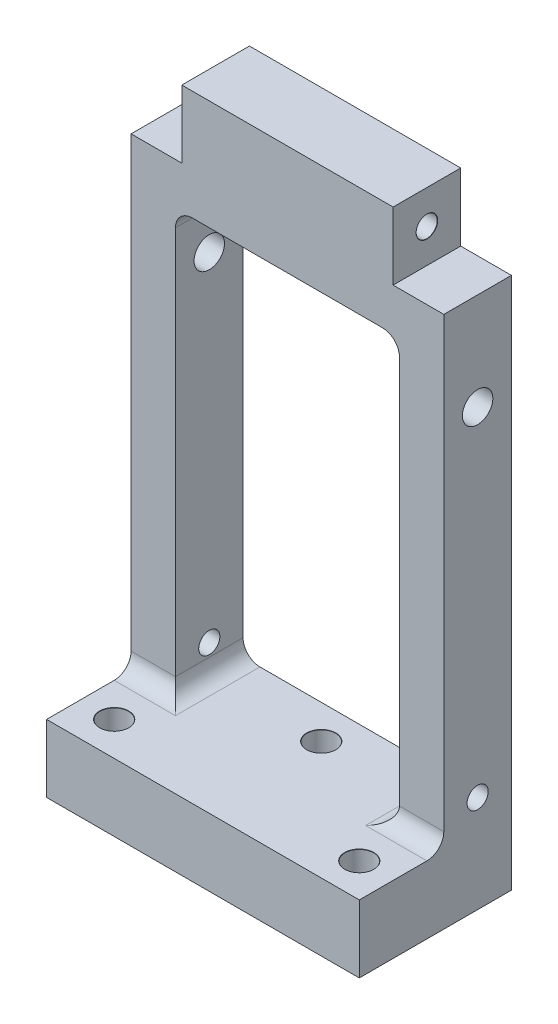
ISO-10303-21;
HEADER;
FILE_DESCRIPTION(('STEP AP214'),'2;1');
FILE_NAME('part.step','',(''),(''),'','','');
FILE_SCHEMA(('AUTOMOTIVE_DESIGN { 1 0 10303 214 1 1 1 1 }'));
ENDSEC;
DATA;
#1=APPLICATION_CONTEXT('core data for automotive mechanical design processes');
#2=APPLICATION_PROTOCOL_DEFINITION('international standard','automotive_design',2000,#1);
#3=PRODUCT_CONTEXT('',#1,'mechanical');
#4=PRODUCT('Part','Part','',(#3));
#5=PRODUCT_RELATED_PRODUCT_CATEGORY('part','',(#4));
#6=PRODUCT_DEFINITION_FORMATION('','',#4);
#7=PRODUCT_DEFINITION_CONTEXT('part definition',#1,'design');
#8=PRODUCT_DEFINITION('design','',#6,#7);
#9=PRODUCT_DEFINITION_SHAPE('','',#8);
#10=(LENGTH_UNIT() NAMED_UNIT(*) SI_UNIT(.MILLI.,.METRE.));
#11=(NAMED_UNIT(*) PLANE_ANGLE_UNIT() SI_UNIT($,.RADIAN.));
#12=(NAMED_UNIT(*) SI_UNIT($,.STERADIAN.) SOLID_ANGLE_UNIT());
#13=UNCERTAINTY_MEASURE_WITH_UNIT(LENGTH_MEASURE(1.E-05),#10,'distance_accuracy_value','');
#14=(GEOMETRIC_REPRESENTATION_CONTEXT(3) GLOBAL_UNCERTAINTY_ASSIGNED_CONTEXT((#13)) GLOBAL_UNIT_ASSIGNED_CONTEXT((#10,
#11,#12)) REPRESENTATION_CONTEXT('',''));
#15=CARTESIAN_POINT('',(0.,0.,0.));
#16=DIRECTION('',(0.,0.,1.));
#17=DIRECTION('',(1.,0.,0.));
#18=AXIS2_PLACEMENT_3D('',#15,#16,#17);
#19=CARTESIAN_POINT('',(-18.5,63.,8.));
#20=DIRECTION('',(0.,-1.,0.));
#21=DIRECTION('',(0.,0.,-1.));
#22=AXIS2_PLACEMENT_3D('',#19,#20,#21);
#23=PLANE('',#22);
#24=DIRECTION('',(0.,0.,-1.));
#25=VECTOR('',#24,1.);
#26=CARTESIAN_POINT('',(12.5,63.,34.2488094968134));
#27=LINE('',#26,#25);
#28=CARTESIAN_POINT('',(12.5,63.,8.));
#29=VERTEX_POINT('',#28);
#30=CARTESIAN_POINT('',(12.5,63.,0.));
#31=VERTEX_POINT('',#30);
#32=EDGE_CURVE('E65',#29,#31,#27,.T.);
#33=ORIENTED_EDGE('',*,*,#32,.F.);
#34=DIRECTION('',(-1.,0.,0.));
#35=VECTOR('',#34,1.);
#36=CARTESIAN_POINT('',(-18.5,63.,8.));
#37=LINE('',#36,#35);
#38=CARTESIAN_POINT('',(18.5,63.,8.));
#39=VERTEX_POINT('',#38);
#40=EDGE_CURVE('E332',#39,#29,#37,.T.);
#41=ORIENTED_EDGE('',*,*,#40,.F.);
#42=DIRECTION('',(0.,0.,-1.));
#43=VECTOR('',#42,1.);
#44=CARTESIAN_POINT('',(18.5,63.,8.));
#45=LINE('',#44,#43);
#46=CARTESIAN_POINT('',(18.5,63.,0.));
#47=VERTEX_POINT('',#46);
#48=EDGE_CURVE('E350',#39,#47,#45,.T.);
#49=ORIENTED_EDGE('',*,*,#48,.T.);
#50=DIRECTION('',(-1.,0.,0.));
#51=VECTOR('',#50,1.);
#52=CARTESIAN_POINT('',(-18.5,63.,0.));
#53=LINE('',#52,#51);
#54=EDGE_CURVE('E329',#47,#31,#53,.T.);
#55=ORIENTED_EDGE('',*,*,#54,.T.);
#56=EDGE_LOOP('',(#33,#41,#49,#55));
#57=FACE_BOUND('',#56,.T.);
#58=ADVANCED_FACE('F39',(#57),#23,.F.);
#59=CARTESIAN_POINT('',(0.,0.,8.));
#60=DIRECTION('',(0.,0.,-1.));
#61=DIRECTION('',(-1.,0.,0.));
#62=AXIS2_PLACEMENT_3D('',#59,#60,#61);
#63=PLANE('',#62);
#64=DIRECTION('',(0.,1.,0.));
#65=VECTOR('',#64,1.);
#66=CARTESIAN_POINT('',(13.25,58.,8.));
#67=LINE('',#66,#65);
#68=CARTESIAN_POINT('',(13.25,10.,8.));
#69=VERTEX_POINT('',#68);
#70=CARTESIAN_POINT('',(13.25,56.,8.));
#71=VERTEX_POINT('',#70);
#72=EDGE_CURVE('E289',#69,#71,#67,.T.);
#73=ORIENTED_EDGE('',*,*,#72,.F.);
#74=DIRECTION('',(-1.,0.,0.));
#75=VECTOR('',#74,1.);
#76=CARTESIAN_POINT('',(0.,10.,8.));
#77=LINE('',#76,#75);
#78=CARTESIAN_POINT('',(18.5,10.,8.));
#79=VERTEX_POINT('',#78);
#80=EDGE_CURVE('E399',#69,#79,#77,.F.);
#81=ORIENTED_EDGE('',*,*,#80,.T.);
#82=DIRECTION('',(0.,1.,0.));
#83=VECTOR('',#82,1.);
#84=CARTESIAN_POINT('',(18.5,0.,8.));
#85=LINE('',#84,#83);
#86=EDGE_CURVE('E328',#79,#39,#85,.T.);
#87=ORIENTED_EDGE('',*,*,#86,.T.);
#88=ORIENTED_EDGE('',*,*,#40,.T.);
#89=DIRECTION('',(0.,1.,0.));
#90=VECTOR('',#89,1.);
#91=CARTESIAN_POINT('',(12.5,63.,8.));
#92=LINE('',#91,#90);
#93=CARTESIAN_POINT('',(12.5,71.,8.));
#94=VERTEX_POINT('',#93);
#95=EDGE_CURVE('E215',#29,#94,#92,.T.);
#96=ORIENTED_EDGE('',*,*,#95,.T.);
#97=DIRECTION('',(-1.,0.,0.));
#98=VECTOR('',#97,1.);
#99=CARTESIAN_POINT('',(-12.5,71.,8.));
#100=LINE('',#99,#98);
#101=CARTESIAN_POINT('',(-12.5,71.,8.));
#102=VERTEX_POINT('',#101);
#103=EDGE_CURVE('E220',#94,#102,#100,.T.);
#104=ORIENTED_EDGE('',*,*,#103,.T.);
#105=DIRECTION('',(0.,-1.,0.));
#106=VECTOR('',#105,1.);
#107=CARTESIAN_POINT('',(-12.5,63.,8.));
#108=LINE('',#107,#106);
#109=CARTESIAN_POINT('',(-12.5,63.,8.));
#110=VERTEX_POINT('',#109);
#111=EDGE_CURVE('E180',#102,#110,#108,.T.);
#112=ORIENTED_EDGE('',*,*,#111,.T.);
#113=CARTESIAN_POINT('',(-18.5,63.,8.));
#114=VERTEX_POINT('',#113);
#115=EDGE_CURVE('E57',#110,#114,#37,.T.);
#116=ORIENTED_EDGE('',*,*,#115,.T.);
#117=DIRECTION('',(0.,-1.,0.));
#118=VECTOR('',#117,1.);
#119=CARTESIAN_POINT('',(-18.5,0.,8.));
#120=LINE('',#119,#118);
#121=CARTESIAN_POINT('',(-18.5,9.99999999999999,8.));
#122=VERTEX_POINT('',#121);
#123=EDGE_CURVE('E324',#114,#122,#120,.T.);
#124=ORIENTED_EDGE('',*,*,#123,.T.);
#125=DIRECTION('',(-1.,0.,0.));
#126=VECTOR('',#125,1.);
#127=CARTESIAN_POINT('',(0.,10.,8.));
#128=LINE('',#127,#126);
#129=CARTESIAN_POINT('',(-13.25,9.99999999999999,8.));
#130=VERTEX_POINT('',#129);
#131=EDGE_CURVE('E396',#122,#130,#128,.F.);
#132=ORIENTED_EDGE('',*,*,#131,.T.);
#133=DIRECTION('',(0.,-1.,0.));
#134=VECTOR('',#133,1.);
#135=CARTESIAN_POINT('',(-13.25,58.,8.));
#136=LINE('',#135,#134);
#137=CARTESIAN_POINT('',(-13.25,56.,8.));
#138=VERTEX_POINT('',#137);
#139=EDGE_CURVE('E285',#138,#130,#136,.T.);
#140=ORIENTED_EDGE('',*,*,#139,.F.);
#141=CARTESIAN_POINT('',(-11.25,56.,8.));
#142=DIRECTION('',(0.,0.,-1.));
#143=DIRECTION('',(-1.,0.,0.));
#144=AXIS2_PLACEMENT_3D('',#141,#142,#143);
#145=CIRCLE('',#144,2.);
#146=CARTESIAN_POINT('',(-11.25,58.,8.));
#147=VERTEX_POINT('',#146);
#148=EDGE_CURVE('E402',#138,#147,#145,.T.);
#149=ORIENTED_EDGE('',*,*,#148,.T.);
#150=DIRECTION('',(-1.,0.,0.));
#151=VECTOR('',#150,1.);
#152=CARTESIAN_POINT('',(-13.25,58.,8.));
#153=LINE('',#152,#151);
#154=CARTESIAN_POINT('',(11.25,58.,8.));
#155=VERTEX_POINT('',#154);
#156=EDGE_CURVE('E293',#155,#147,#153,.T.);
#157=ORIENTED_EDGE('',*,*,#156,.F.);
#158=CARTESIAN_POINT('',(11.25,56.,8.));
#159=DIRECTION('',(0.,0.,-1.));
#160=DIRECTION('',(-1.,0.,0.));
#161=AXIS2_PLACEMENT_3D('',#158,#159,#160);
#162=CIRCLE('',#161,2.);
#163=EDGE_CURVE('E408',#155,#71,#162,.T.);
#164=ORIENTED_EDGE('',*,*,#163,.T.);
#165=EDGE_LOOP('',(#73,#81,#87,#88,#96,#104,#112,#116,#124,#132,#140,#149,#157,#164));
#166=FACE_BOUND('',#165,.T.);
#167=ADVANCED_FACE('F447',(#166),#63,.F.);
#168=CARTESIAN_POINT('',(-18.5,0.,8.));
#169=DIRECTION('',(1.,0.,0.));
#170=DIRECTION('',(0.,1.,0.));
#171=AXIS2_PLACEMENT_3D('',#168,#169,#170);
#172=PLANE('',#171);
#173=CARTESIAN_POINT('',(-18.5,51.5,4.00000000000001));
#174=DIRECTION('',(-1.,0.,0.));
#175=DIRECTION('',(0.,0.,1.));
#176=AXIS2_PLACEMENT_3D('',#173,#174,#175);
#177=CIRCLE('',#176,1.825);
#178=CARTESIAN_POINT('',(-18.5,51.5,5.82500000000001));
#179=VERTEX_POINT('',#178);
#180=EDGE_CURVE('E902',#179,#179,#177,.T.);
#181=ORIENTED_EDGE('',*,*,#180,.F.);
#182=EDGE_LOOP('',(#181));
#183=FACE_BOUND('',#182,.T.);
#184=CARTESIAN_POINT('',(-18.5,11.5,4.00000000000001));
#185=DIRECTION('',(-1.,0.,0.));
#186=DIRECTION('',(0.,0.,1.));
#187=AXIS2_PLACEMENT_3D('',#184,#185,#186);
#188=CIRCLE('',#187,1.275);
#189=CARTESIAN_POINT('',(-18.5,11.5,5.27500000000001));
#190=VERTEX_POINT('',#189);
#191=EDGE_CURVE('E439',#190,#190,#188,.T.);
#192=ORIENTED_EDGE('',*,*,#191,.F.);
#193=EDGE_LOOP('',(#192));
#194=FACE_BOUND('',#193,.T.);
#195=DIRECTION('',(0.,-1.,0.));
#196=VECTOR('',#195,1.);
#197=CARTESIAN_POINT('',(-18.5,0.,0.));
#198=LINE('',#197,#196);
#199=CARTESIAN_POINT('',(-18.5,63.,0.));
#200=VERTEX_POINT('',#199);
#201=CARTESIAN_POINT('',(-18.5,0.,0.));
#202=VERTEX_POINT('',#201);
#203=EDGE_CURVE('E310',#200,#202,#198,.T.);
#204=ORIENTED_EDGE('',*,*,#203,.T.);
#205=DIRECTION('',(0.,0.,-1.));
#206=VECTOR('',#205,1.);
#207=CARTESIAN_POINT('',(-18.5,0.,8.));
#208=LINE('',#207,#206);
#209=CARTESIAN_POINT('',(-18.5,0.,18.));
#210=VERTEX_POINT('',#209);
#211=EDGE_CURVE('E358',#210,#202,#208,.T.);
#212=ORIENTED_EDGE('',*,*,#211,.F.);
#213=DIRECTION('',(0.,1.,0.));
#214=VECTOR('',#213,1.);
#215=CARTESIAN_POINT('',(-18.5,0.,18.));
#216=LINE('',#215,#214);
#217=CARTESIAN_POINT('',(-18.5,7.99999999999999,18.));
#218=VERTEX_POINT('',#217);
#219=EDGE_CURVE('E301',#210,#218,#216,.T.);
#220=ORIENTED_EDGE('',*,*,#219,.T.);
#221=DIRECTION('',(0.,0.,-1.));
#222=VECTOR('',#221,1.);
#223=CARTESIAN_POINT('',(-18.5,7.99999999999999,8.));
#224=LINE('',#223,#222);
#225=CARTESIAN_POINT('',(-18.5,7.99999999999999,10.));
#226=VERTEX_POINT('',#225);
#227=EDGE_CURVE('E314',#218,#226,#224,.T.);
#228=ORIENTED_EDGE('',*,*,#227,.T.);
#229=CARTESIAN_POINT('',(-18.5,9.99999999999999,10.));
#230=DIRECTION('',(1.,0.,0.));
#231=DIRECTION('',(0.,1.,0.));
#232=AXIS2_PLACEMENT_3D('',#229,#230,#231);
#233=CIRCLE('',#232,2.);
#234=EDGE_CURVE('E49',#226,#122,#233,.T.);
#235=ORIENTED_EDGE('',*,*,#234,.T.);
#236=ORIENTED_EDGE('',*,*,#123,.F.);
#237=DIRECTION('',(0.,0.,-1.));
#238=VECTOR('',#237,1.);
#239=CARTESIAN_POINT('',(-18.5,63.,8.));
#240=LINE('',#239,#238);
#241=EDGE_CURVE('E335',#114,#200,#240,.T.);
#242=ORIENTED_EDGE('',*,*,#241,.T.);
#243=EDGE_LOOP('',(#204,#212,#220,#228,#235,#236,#242));
#244=FACE_BOUND('',#243,.T.);
#245=ADVANCED_FACE('F452',(#183,#194,#244),#172,.F.);
#246=CARTESIAN_POINT('',(-18.5,0.,8.));
#247=DIRECTION('',(0.,1.,0.));
#248=DIRECTION('',(-1.,0.,0.));
#249=AXIS2_PLACEMENT_3D('',#246,#247,#248);
#250=PLANE('',#249);
#251=CARTESIAN_POINT('',(-14.5,0.,14.));
#252=DIRECTION('',(0.,1.,0.));
#253=DIRECTION('',(0.,0.,1.));
#254=AXIS2_PLACEMENT_3D('',#251,#252,#253);
#255=CIRCLE('',#254,1.725);
#256=CARTESIAN_POINT('',(-14.5,0.,15.725));
#257=VERTEX_POINT('',#256);
#258=EDGE_CURVE('E224',#257,#257,#255,.T.);
#259=ORIENTED_EDGE('',*,*,#258,.T.);
#260=EDGE_LOOP('',(#259));
#261=FACE_BOUND('',#260,.T.);
#262=CARTESIAN_POINT('',(14.5,0.,14.));
#263=DIRECTION('',(0.,1.,0.));
#264=DIRECTION('',(0.,0.,1.));
#265=AXIS2_PLACEMENT_3D('',#262,#263,#264);
#266=CIRCLE('',#265,1.725);
#267=CARTESIAN_POINT('',(14.5,0.,15.725));
#268=VERTEX_POINT('',#267);
#269=EDGE_CURVE('E241',#268,#268,#266,.T.);
#270=ORIENTED_EDGE('',*,*,#269,.T.);
#271=EDGE_LOOP('',(#270));
#272=FACE_BOUND('',#271,.T.);
#273=CARTESIAN_POINT('',(0.,0.,4.));
#274=DIRECTION('',(0.,1.,0.));
#275=DIRECTION('',(0.,0.,1.));
#276=AXIS2_PLACEMENT_3D('',#273,#274,#275);
#277=CIRCLE('',#276,1.725);
#278=CARTESIAN_POINT('',(0.,0.,5.725));
#279=VERTEX_POINT('',#278);
#280=EDGE_CURVE('E257',#279,#279,#277,.T.);
#281=ORIENTED_EDGE('',*,*,#280,.T.);
#282=EDGE_LOOP('',(#281));
#283=FACE_BOUND('',#282,.T.);
#284=DIRECTION('',(1.,0.,0.));
#285=VECTOR('',#284,1.);
#286=CARTESIAN_POINT('',(-18.5,0.,0.));
#287=LINE('',#286,#285);
#288=CARTESIAN_POINT('',(18.5,0.,0.));
#289=VERTEX_POINT('',#288);
#290=EDGE_CURVE('E339',#202,#289,#287,.T.);
#291=ORIENTED_EDGE('',*,*,#290,.T.);
#292=DIRECTION('',(0.,0.,-1.));
#293=VECTOR('',#292,1.);
#294=CARTESIAN_POINT('',(18.5,0.,8.));
#295=LINE('',#294,#293);
#296=CARTESIAN_POINT('',(18.5,0.,18.));
#297=VERTEX_POINT('',#296);
#298=EDGE_CURVE('E354',#297,#289,#295,.T.);
#299=ORIENTED_EDGE('',*,*,#298,.F.);
#300=DIRECTION('',(-1.,0.,0.));
#301=VECTOR('',#300,1.);
#302=CARTESIAN_POINT('',(31.3062484748657,0.,18.));
#303=LINE('',#302,#301);
#304=EDGE_CURVE('E318',#297,#210,#303,.T.);
#305=ORIENTED_EDGE('',*,*,#304,.T.);
#306=ORIENTED_EDGE('',*,*,#211,.T.);
#307=EDGE_LOOP('',(#291,#299,#305,#306));
#308=FACE_BOUND('',#307,.T.);
#309=ADVANCED_FACE('F456',(#261,#272,#283,#308),#250,.F.);
#310=CARTESIAN_POINT('',(18.5,0.,8.));
#311=DIRECTION('',(-1.,0.,0.));
#312=DIRECTION('',(0.,-1.,0.));
#313=AXIS2_PLACEMENT_3D('',#310,#311,#312);
#314=PLANE('',#313);
#315=CARTESIAN_POINT('',(18.5,51.5,4.00000000000001));
#316=DIRECTION('',(-1.,0.,0.));
#317=DIRECTION('',(0.,0.,1.));
#318=AXIS2_PLACEMENT_3D('',#315,#316,#317);
#319=CIRCLE('',#318,1.79999999999999);
#320=CARTESIAN_POINT('',(18.5,51.5,5.8));
#321=VERTEX_POINT('',#320);
#322=EDGE_CURVE('E910',#321,#321,#319,.T.);
#323=ORIENTED_EDGE('',*,*,#322,.T.);
#324=EDGE_LOOP('',(#323));
#325=FACE_BOUND('',#324,.T.);
#326=CARTESIAN_POINT('',(18.5,11.5,4.00000000000001));
#327=DIRECTION('',(-1.,0.,0.));
#328=DIRECTION('',(0.,0.,1.));
#329=AXIS2_PLACEMENT_3D('',#326,#327,#328);
#330=CIRCLE('',#329,1.24999999999999);
#331=CARTESIAN_POINT('',(18.5,11.5,5.25));
#332=VERTEX_POINT('',#331);
#333=EDGE_CURVE('E428',#332,#332,#330,.T.);
#334=ORIENTED_EDGE('',*,*,#333,.T.);
#335=EDGE_LOOP('',(#334));
#336=FACE_BOUND('',#335,.T.);
#337=DIRECTION('',(0.,1.,0.));
#338=VECTOR('',#337,1.);
#339=CARTESIAN_POINT('',(18.5,0.,0.));
#340=LINE('',#339,#338);
#341=EDGE_CURVE('E342',#289,#47,#340,.T.);
#342=ORIENTED_EDGE('',*,*,#341,.T.);
#343=ORIENTED_EDGE('',*,*,#48,.F.);
#344=ORIENTED_EDGE('',*,*,#86,.F.);
#345=CARTESIAN_POINT('',(18.5,10.,10.));
#346=DIRECTION('',(-1.,0.,0.));
#347=DIRECTION('',(0.,-1.,0.));
#348=AXIS2_PLACEMENT_3D('',#345,#346,#347);
#349=CIRCLE('',#348,2.);
#350=CARTESIAN_POINT('',(18.5,8.00000000000001,10.));
#351=VERTEX_POINT('',#350);
#352=EDGE_CURVE('E414',#79,#351,#349,.T.);
#353=ORIENTED_EDGE('',*,*,#352,.T.);
#354=DIRECTION('',(0.,0.,1.));
#355=VECTOR('',#354,1.);
#356=CARTESIAN_POINT('',(18.5,8.00000000000001,8.));
#357=LINE('',#356,#355);
#358=CARTESIAN_POINT('',(18.5,8.00000000000001,18.));
#359=VERTEX_POINT('',#358);
#360=EDGE_CURVE('E306',#351,#359,#357,.T.);
#361=ORIENTED_EDGE('',*,*,#360,.T.);
#362=DIRECTION('',(0.,-1.,0.));
#363=VECTOR('',#362,1.);
#364=CARTESIAN_POINT('',(18.5,0.,18.));
#365=LINE('',#364,#363);
#366=EDGE_CURVE('E302',#359,#297,#365,.T.);
#367=ORIENTED_EDGE('',*,*,#366,.T.);
#368=ORIENTED_EDGE('',*,*,#298,.T.);
#369=EDGE_LOOP('',(#342,#343,#344,#353,#361,#367,#368));
#370=FACE_BOUND('',#369,.T.);
#371=ADVANCED_FACE('F510',(#325,#336,#370),#314,.F.);
#372=ORIENTED_EDGE('',*,*,#115,.F.);
#373=DIRECTION('',(0.,0.,-1.));
#374=VECTOR('',#373,1.);
#375=CARTESIAN_POINT('',(-12.5,63.,34.2488094968134));
#376=LINE('',#375,#374);
#377=CARTESIAN_POINT('',(-12.5,63.,0.));
#378=VERTEX_POINT('',#377);
#379=EDGE_CURVE('E212',#110,#378,#376,.T.);
#380=ORIENTED_EDGE('',*,*,#379,.T.);
#381=EDGE_CURVE('E199',#378,#200,#53,.T.);
#382=ORIENTED_EDGE('',*,*,#381,.T.);
#383=ORIENTED_EDGE('',*,*,#241,.F.);
#384=EDGE_LOOP('',(#372,#380,#382,#383));
#385=FACE_BOUND('',#384,.T.);
#386=ADVANCED_FACE('F448',(#385),#23,.F.);
#387=CARTESIAN_POINT('',(0.,0.,0.));
#388=DIRECTION('',(0.,0.,-1.));
#389=DIRECTION('',(-1.,0.,0.));
#390=AXIS2_PLACEMENT_3D('',#387,#388,#389);
#391=PLANE('',#390);
#392=DIRECTION('',(-1.,0.,0.));
#393=VECTOR('',#392,1.);
#394=CARTESIAN_POINT('',(-13.25,58.,0.));
#395=LINE('',#394,#393);
#396=CARTESIAN_POINT('',(11.25,58.,0.));
#397=VERTEX_POINT('',#396);
#398=CARTESIAN_POINT('',(-11.25,58.,0.));
#399=VERTEX_POINT('',#398);
#400=EDGE_CURVE('E277',#397,#399,#395,.T.);
#401=ORIENTED_EDGE('',*,*,#400,.T.);
#402=CARTESIAN_POINT('',(-11.25,56.,0.));
#403=DIRECTION('',(0.,0.,-1.));
#404=DIRECTION('',(-1.,0.,0.));
#405=AXIS2_PLACEMENT_3D('',#402,#403,#404);
#406=CIRCLE('',#405,2.);
#407=CARTESIAN_POINT('',(-13.25,56.,0.));
#408=VERTEX_POINT('',#407);
#409=EDGE_CURVE('E405',#399,#408,#406,.F.);
#410=ORIENTED_EDGE('',*,*,#409,.T.);
#411=DIRECTION('',(0.,-1.,0.));
#412=VECTOR('',#411,1.);
#413=CARTESIAN_POINT('',(-13.25,58.,0.));
#414=LINE('',#413,#412);
#415=CARTESIAN_POINT('',(-13.25,9.99999999999999,0.));
#416=VERTEX_POINT('',#415);
#417=EDGE_CURVE('E281',#408,#416,#414,.T.);
#418=ORIENTED_EDGE('',*,*,#417,.T.);
#419=CARTESIAN_POINT('',(-11.25,10.,0.));
#420=DIRECTION('',(0.,0.,-1.));
#421=DIRECTION('',(-1.,0.,0.));
#422=AXIS2_PLACEMENT_3D('',#419,#420,#421);
#423=CIRCLE('',#422,2.);
#424=CARTESIAN_POINT('',(-11.25,8.00000000000001,0.));
#425=VERTEX_POINT('',#424);
#426=EDGE_CURVE('E11',#416,#425,#423,.F.);
#427=ORIENTED_EDGE('',*,*,#426,.T.);
#428=DIRECTION('',(1.,0.,0.));
#429=VECTOR('',#428,1.);
#430=CARTESIAN_POINT('',(-13.25,8.00000000000001,0.));
#431=LINE('',#430,#429);
#432=CARTESIAN_POINT('',(11.25,8.00000000000001,0.));
#433=VERTEX_POINT('',#432);
#434=EDGE_CURVE('E297',#425,#433,#431,.T.);
#435=ORIENTED_EDGE('',*,*,#434,.T.);
#436=CARTESIAN_POINT('',(11.25,10.,0.));
#437=DIRECTION('',(0.,0.,-1.));
#438=DIRECTION('',(-1.,0.,0.));
#439=AXIS2_PLACEMENT_3D('',#436,#437,#438);
#440=CIRCLE('',#439,2.);
#441=CARTESIAN_POINT('',(13.25,10.,0.));
#442=VERTEX_POINT('',#441);
#443=EDGE_CURVE('E417',#433,#442,#440,.F.);
#444=ORIENTED_EDGE('',*,*,#443,.T.);
#445=DIRECTION('',(0.,1.,0.));
#446=VECTOR('',#445,1.);
#447=CARTESIAN_POINT('',(13.25,58.,0.));
#448=LINE('',#447,#446);
#449=CARTESIAN_POINT('',(13.25,56.,0.));
#450=VERTEX_POINT('',#449);
#451=EDGE_CURVE('E273',#442,#450,#448,.T.);
#452=ORIENTED_EDGE('',*,*,#451,.T.);
#453=CARTESIAN_POINT('',(11.25,56.,0.));
#454=DIRECTION('',(0.,0.,-1.));
#455=DIRECTION('',(-1.,0.,0.));
#456=AXIS2_PLACEMENT_3D('',#453,#454,#455);
#457=CIRCLE('',#456,2.);
#458=EDGE_CURVE('E411',#450,#397,#457,.F.);
#459=ORIENTED_EDGE('',*,*,#458,.T.);
#460=EDGE_LOOP('',(#401,#410,#418,#427,#435,#444,#452,#459));
#461=FACE_BOUND('',#460,.T.);
#462=ORIENTED_EDGE('',*,*,#203,.F.);
#463=ORIENTED_EDGE('',*,*,#381,.F.);
#464=DIRECTION('',(0.,1.,0.));
#465=VECTOR('',#464,1.);
#466=CARTESIAN_POINT('',(-12.5,63.,0.));
#467=LINE('',#466,#465);
#468=CARTESIAN_POINT('',(-12.5,71.,0.));
#469=VERTEX_POINT('',#468);
#470=EDGE_CURVE('E179',#378,#469,#467,.T.);
#471=ORIENTED_EDGE('',*,*,#470,.T.);
#472=DIRECTION('',(1.,0.,0.));
#473=VECTOR('',#472,1.);
#474=CARTESIAN_POINT('',(-12.5,71.,0.));
#475=LINE('',#474,#473);
#476=CARTESIAN_POINT('',(12.5,71.,0.));
#477=VERTEX_POINT('',#476);
#478=EDGE_CURVE('E188',#469,#477,#475,.T.);
#479=ORIENTED_EDGE('',*,*,#478,.T.);
#480=DIRECTION('',(0.,-1.,0.));
#481=VECTOR('',#480,1.);
#482=CARTESIAN_POINT('',(12.5,63.,0.));
#483=LINE('',#482,#481);
#484=EDGE_CURVE('E185',#477,#31,#483,.T.);
#485=ORIENTED_EDGE('',*,*,#484,.T.);
#486=ORIENTED_EDGE('',*,*,#54,.F.);
#487=ORIENTED_EDGE('',*,*,#341,.F.);
#488=ORIENTED_EDGE('',*,*,#290,.F.);
#489=EDGE_LOOP('',(#462,#463,#471,#479,#485,#486,#487,#488));
#490=FACE_BOUND('',#489,.T.);
#491=ADVANCED_FACE('F198',(#461,#490),#391,.T.);
#492=CARTESIAN_POINT('',(31.3062484748657,8.00000000000001,8.));
#493=DIRECTION('',(0.,1.,0.));
#494=DIRECTION('',(-1.,0.,0.));
#495=AXIS2_PLACEMENT_3D('',#492,#493,#494);
#496=PLANE('',#495);
#497=CARTESIAN_POINT('',(-14.5,7.99999999999999,14.));
#498=DIRECTION('',(0.,1.,0.));
#499=DIRECTION('',(0.,0.,1.));
#500=AXIS2_PLACEMENT_3D('',#497,#498,#499);
#501=CIRCLE('',#500,1.725);
#502=CARTESIAN_POINT('',(-14.5,7.99999999999999,15.725));
#503=VERTEX_POINT('',#502);
#504=EDGE_CURVE('E228',#503,#503,#501,.T.);
#505=ORIENTED_EDGE('',*,*,#504,.F.);
#506=EDGE_LOOP('',(#505));
#507=FACE_BOUND('',#506,.T.);
#508=CARTESIAN_POINT('',(14.5,8.00000000000001,14.));
#509=DIRECTION('',(0.,1.,0.));
#510=DIRECTION('',(0.,0.,1.));
#511=AXIS2_PLACEMENT_3D('',#508,#509,#510);
#512=CIRCLE('',#511,1.725);
#513=CARTESIAN_POINT('',(14.5,8.00000000000001,15.725));
#514=VERTEX_POINT('',#513);
#515=EDGE_CURVE('E245',#514,#514,#512,.T.);
#516=ORIENTED_EDGE('',*,*,#515,.F.);
#517=EDGE_LOOP('',(#516));
#518=FACE_BOUND('',#517,.T.);
#519=CARTESIAN_POINT('',(0.,8.,4.));
#520=DIRECTION('',(0.,1.,0.));
#521=DIRECTION('',(0.,0.,1.));
#522=AXIS2_PLACEMENT_3D('',#519,#520,#521);
#523=CIRCLE('',#522,1.725);
#524=CARTESIAN_POINT('',(0.,8.,5.725));
#525=VERTEX_POINT('',#524);
#526=EDGE_CURVE('E261',#525,#525,#523,.T.);
#527=ORIENTED_EDGE('',*,*,#526,.F.);
#528=EDGE_LOOP('',(#527));
#529=FACE_BOUND('',#528,.T.);
#530=ORIENTED_EDGE('',*,*,#360,.F.);
#531=DIRECTION('',(-1.,0.,0.));
#532=VECTOR('',#531,1.);
#533=CARTESIAN_POINT('',(31.3062484748657,8.00000000000001,10.));
#534=LINE('',#533,#532);
#535=CARTESIAN_POINT('',(11.25,8.00000000000001,10.));
#536=VERTEX_POINT('',#535);
#537=EDGE_CURVE('E392',#351,#536,#534,.T.);
#538=ORIENTED_EDGE('',*,*,#537,.T.);
#539=DIRECTION('',(0.,0.,1.));
#540=VECTOR('',#539,1.);
#541=CARTESIAN_POINT('',(11.25,8.00000000000001,8.));
#542=LINE('',#541,#540);
#543=EDGE_CURVE('E389',#536,#433,#542,.F.);
#544=ORIENTED_EDGE('',*,*,#543,.T.);
#545=ORIENTED_EDGE('',*,*,#434,.F.);
#546=DIRECTION('',(0.,0.,1.));
#547=VECTOR('',#546,1.);
#548=CARTESIAN_POINT('',(-11.25,8.,8.));
#549=LINE('',#548,#547);
#550=CARTESIAN_POINT('',(-11.25,8.,10.));
#551=VERTEX_POINT('',#550);
#552=EDGE_CURVE('E382',#425,#551,#549,.T.);
#553=ORIENTED_EDGE('',*,*,#552,.T.);
#554=DIRECTION('',(-1.,0.,0.));
#555=VECTOR('',#554,1.);
#556=CARTESIAN_POINT('',(31.3062484748657,8.00000000000001,10.));
#557=LINE('',#556,#555);
#558=EDGE_CURVE('E385',#551,#226,#557,.T.);
#559=ORIENTED_EDGE('',*,*,#558,.T.);
#560=ORIENTED_EDGE('',*,*,#227,.F.);
#561=DIRECTION('',(-1.,0.,0.));
#562=VECTOR('',#561,1.);
#563=CARTESIAN_POINT('',(31.3062484748657,8.00000000000001,18.));
#564=LINE('',#563,#562);
#565=EDGE_CURVE('E307',#359,#218,#564,.T.);
#566=ORIENTED_EDGE('',*,*,#565,.F.);
#567=EDGE_LOOP('',(#530,#538,#544,#545,#553,#559,#560,#566));
#568=FACE_BOUND('',#567,.T.);
#569=ADVANCED_FACE('F464',(#507,#518,#529,#568),#496,.T.);
#570=CARTESIAN_POINT('',(31.3062484748657,0.,18.));
#571=DIRECTION('',(0.,0.,1.));
#572=DIRECTION('',(1.,0.,0.));
#573=AXIS2_PLACEMENT_3D('',#570,#571,#572);
#574=PLANE('',#573);
#575=ORIENTED_EDGE('',*,*,#366,.F.);
#576=ORIENTED_EDGE('',*,*,#565,.T.);
#577=ORIENTED_EDGE('',*,*,#219,.F.);
#578=ORIENTED_EDGE('',*,*,#304,.F.);
#579=EDGE_LOOP('',(#575,#576,#577,#578));
#580=FACE_BOUND('',#579,.T.);
#581=ADVANCED_FACE('F665',(#580),#574,.T.);
#582=CARTESIAN_POINT('',(-13.25,58.,-0.000999999999999265));
#583=DIRECTION('',(-1.,0.,0.));
#584=DIRECTION('',(0.,-1.,0.));
#585=AXIS2_PLACEMENT_3D('',#582,#583,#584);
#586=PLANE('',#585);
#587=CARTESIAN_POINT('',(-13.25,51.5,4.00000000000001));
#588=DIRECTION('',(-1.,0.,0.));
#589=DIRECTION('',(0.,-1.,0.));
#590=AXIS2_PLACEMENT_3D('',#587,#588,#589);
#591=CIRCLE('',#590,1.79999999999999);
#592=CARTESIAN_POINT('',(-13.25,49.7,4.00000000000001));
#593=VERTEX_POINT('',#592);
#594=EDGE_CURVE('E43',#593,#593,#591,.T.);
#595=ORIENTED_EDGE('',*,*,#594,.T.);
#596=EDGE_LOOP('',(#595));
#597=FACE_BOUND('',#596,.T.);
#598=CARTESIAN_POINT('',(-13.25,11.5,4.00000000000001));
#599=DIRECTION('',(-1.,0.,0.));
#600=DIRECTION('',(0.,-1.,0.));
#601=AXIS2_PLACEMENT_3D('',#598,#599,#600);
#602=CIRCLE('',#601,1.24999999999999);
#603=CARTESIAN_POINT('',(-13.25,10.25,4.00000000000001));
#604=VERTEX_POINT('',#603);
#605=EDGE_CURVE('E205',#604,#604,#602,.T.);
#606=ORIENTED_EDGE('',*,*,#605,.T.);
#607=EDGE_LOOP('',(#606));
#608=FACE_BOUND('',#607,.T.);
#609=ORIENTED_EDGE('',*,*,#417,.F.);
#610=DIRECTION('',(0.,0.,1.));
#611=VECTOR('',#610,1.);
#612=CARTESIAN_POINT('',(-13.25,56.,8.));
#613=LINE('',#612,#611);
#614=EDGE_CURVE('E365',#408,#138,#613,.T.);
#615=ORIENTED_EDGE('',*,*,#614,.T.);
#616=ORIENTED_EDGE('',*,*,#139,.T.);
#617=DIRECTION('',(0.,0.,1.));
#618=VECTOR('',#617,1.);
#619=CARTESIAN_POINT('',(-13.25,9.99999999999999,-0.000999999999999265));
#620=LINE('',#619,#618);
#621=EDGE_CURVE('E362',#130,#416,#620,.F.);
#622=ORIENTED_EDGE('',*,*,#621,.T.);
#623=EDGE_LOOP('',(#609,#615,#616,#622));
#624=FACE_BOUND('',#623,.T.);
#625=ADVANCED_FACE('F476',(#597,#608,#624),#586,.F.);
#626=CARTESIAN_POINT('',(-13.25,58.,-0.000999999999999265));
#627=DIRECTION('',(0.,1.,0.));
#628=DIRECTION('',(0.,0.,1.));
#629=AXIS2_PLACEMENT_3D('',#626,#627,#628);
#630=PLANE('',#629);
#631=ORIENTED_EDGE('',*,*,#156,.T.);
#632=DIRECTION('',(0.,0.,1.));
#633=VECTOR('',#632,1.);
#634=CARTESIAN_POINT('',(-11.25,58.,0.));
#635=LINE('',#634,#633);
#636=EDGE_CURVE('E373',#147,#399,#635,.F.);
#637=ORIENTED_EDGE('',*,*,#636,.T.);
#638=ORIENTED_EDGE('',*,*,#400,.F.);
#639=DIRECTION('',(0.,0.,1.));
#640=VECTOR('',#639,1.);
#641=CARTESIAN_POINT('',(11.25,58.,8.));
#642=LINE('',#641,#640);
#643=EDGE_CURVE('E369',#397,#155,#642,.T.);
#644=ORIENTED_EDGE('',*,*,#643,.T.);
#645=EDGE_LOOP('',(#631,#637,#638,#644));
#646=FACE_BOUND('',#645,.T.);
#647=ADVANCED_FACE('F499',(#646),#630,.F.);
#648=CARTESIAN_POINT('',(13.25,58.,-0.000999999999999265));
#649=DIRECTION('',(1.,0.,0.));
#650=DIRECTION('',(0.,1.,0.));
#651=AXIS2_PLACEMENT_3D('',#648,#649,#650);
#652=PLANE('',#651);
#653=CARTESIAN_POINT('',(13.25,51.5,4.00000000000001));
#654=DIRECTION('',(1.,0.,0.));
#655=DIRECTION('',(0.,1.,0.));
#656=AXIS2_PLACEMENT_3D('',#653,#654,#655);
#657=CIRCLE('',#656,1.79999999999999);
#658=CARTESIAN_POINT('',(13.25,53.3,4.00000000000001));
#659=VERTEX_POINT('',#658);
#660=EDGE_CURVE('E913',#659,#659,#657,.T.);
#661=ORIENTED_EDGE('',*,*,#660,.T.);
#662=EDGE_LOOP('',(#661));
#663=FACE_BOUND('',#662,.T.);
#664=CARTESIAN_POINT('',(13.25,11.5,4.00000000000001));
#665=DIRECTION('',(1.,0.,0.));
#666=DIRECTION('',(0.,1.,0.));
#667=AXIS2_PLACEMENT_3D('',#664,#665,#666);
#668=CIRCLE('',#667,1.24999999999999);
#669=CARTESIAN_POINT('',(13.25,12.75,4.00000000000001));
#670=VERTEX_POINT('',#669);
#671=EDGE_CURVE('E201',#670,#670,#668,.T.);
#672=ORIENTED_EDGE('',*,*,#671,.T.);
#673=EDGE_LOOP('',(#672));
#674=FACE_BOUND('',#673,.T.);
#675=ORIENTED_EDGE('',*,*,#72,.T.);
#676=DIRECTION('',(0.,0.,1.));
#677=VECTOR('',#676,1.);
#678=CARTESIAN_POINT('',(13.25,56.,0.));
#679=LINE('',#678,#677);
#680=EDGE_CURVE('E379',#71,#450,#679,.F.);
#681=ORIENTED_EDGE('',*,*,#680,.T.);
#682=ORIENTED_EDGE('',*,*,#451,.F.);
#683=DIRECTION('',(0.,0.,1.));
#684=VECTOR('',#683,1.);
#685=CARTESIAN_POINT('',(13.25,10.,-0.000999999999999265));
#686=LINE('',#685,#684);
#687=EDGE_CURVE('E376',#442,#69,#686,.T.);
#688=ORIENTED_EDGE('',*,*,#687,.T.);
#689=EDGE_LOOP('',(#675,#681,#682,#688));
#690=FACE_BOUND('',#689,.T.);
#691=ADVANCED_FACE('F491',(#663,#674,#690),#652,.F.);
#692=CARTESIAN_POINT('',(0.,0.0250000000000059,4.));
#693=DIRECTION('',(0.,-1.,0.));
#694=DIRECTION('',(0.,0.,-1.));
#695=AXIS2_PLACEMENT_3D('',#692,#693,#694);
#696=CONICAL_SURFACE('',#695,1.7,0.785398163397435);
#697=ORIENTED_EDGE('',*,*,#280,.F.);
#698=EDGE_LOOP('',(#697));
#699=FACE_BOUND('',#698,.T.);
#700=CARTESIAN_POINT('',(0.,0.0250000000000059,4.));
#701=DIRECTION('',(0.,1.,0.));
#702=DIRECTION('',(0.,0.,1.));
#703=AXIS2_PLACEMENT_3D('',#700,#701,#702);
#704=CIRCLE('',#703,1.7);
#705=CARTESIAN_POINT('',(0.,0.0250000000000059,5.7));
#706=VERTEX_POINT('',#705);
#707=EDGE_CURVE('E269',#706,#706,#704,.T.);
#708=ORIENTED_EDGE('',*,*,#707,.T.);
#709=EDGE_LOOP('',(#708));
#710=FACE_BOUND('',#709,.T.);
#711=ADVANCED_FACE('F636',(#699,#710),#696,.F.);
#712=CARTESIAN_POINT('',(0.,8.,4.));
#713=DIRECTION('',(0.,1.,0.));
#714=DIRECTION('',(0.,0.,1.));
#715=AXIS2_PLACEMENT_3D('',#712,#713,#714);
#716=CYLINDRICAL_SURFACE('',#715,1.7);
#717=ORIENTED_EDGE('',*,*,#707,.F.);
#718=EDGE_LOOP('',(#717));
#719=FACE_BOUND('',#718,.T.);
#720=CARTESIAN_POINT('',(0.,7.975,4.));
#721=DIRECTION('',(0.,1.,0.));
#722=DIRECTION('',(0.,0.,1.));
#723=AXIS2_PLACEMENT_3D('',#720,#721,#722);
#724=CIRCLE('',#723,1.7);
#725=CARTESIAN_POINT('',(0.,7.975,5.7));
#726=VERTEX_POINT('',#725);
#727=EDGE_CURVE('E265',#726,#726,#724,.T.);
#728=ORIENTED_EDGE('',*,*,#727,.T.);
#729=EDGE_LOOP('',(#728));
#730=FACE_BOUND('',#729,.T.);
#731=ADVANCED_FACE('F628',(#719,#730),#716,.F.);
#732=CARTESIAN_POINT('',(0.,8.,4.));
#733=DIRECTION('',(0.,1.,0.));
#734=DIRECTION('',(0.,0.,1.));
#735=AXIS2_PLACEMENT_3D('',#732,#733,#734);
#736=CONICAL_SURFACE('',#735,1.725,0.785398163397453);
#737=ORIENTED_EDGE('',*,*,#727,.F.);
#738=EDGE_LOOP('',(#737));
#739=FACE_BOUND('',#738,.T.);
#740=ORIENTED_EDGE('',*,*,#526,.T.);
#741=EDGE_LOOP('',(#740));
#742=FACE_BOUND('',#741,.T.);
#743=ADVANCED_FACE('F620',(#739,#742),#736,.F.);
#744=CARTESIAN_POINT('',(14.5,0.0250000000000111,14.));
#745=DIRECTION('',(0.,-1.,0.));
#746=DIRECTION('',(0.,0.,-1.));
#747=AXIS2_PLACEMENT_3D('',#744,#745,#746);
#748=CONICAL_SURFACE('',#747,1.7,0.785398163397448);
#749=ORIENTED_EDGE('',*,*,#269,.F.);
#750=EDGE_LOOP('',(#749));
#751=FACE_BOUND('',#750,.T.);
#752=CARTESIAN_POINT('',(14.5,0.0250000000000111,14.));
#753=DIRECTION('',(0.,1.,0.));
#754=DIRECTION('',(0.,0.,1.));
#755=AXIS2_PLACEMENT_3D('',#752,#753,#754);
#756=CIRCLE('',#755,1.7);
#757=CARTESIAN_POINT('',(14.5,0.0250000000000111,15.7));
#758=VERTEX_POINT('',#757);
#759=EDGE_CURVE('E253',#758,#758,#756,.T.);
#760=ORIENTED_EDGE('',*,*,#759,.T.);
#761=EDGE_LOOP('',(#760));
#762=FACE_BOUND('',#761,.T.);
#763=ADVANCED_FACE('F612',(#751,#762),#748,.F.);
#764=CARTESIAN_POINT('',(14.5,8.00000000000001,14.));
#765=DIRECTION('',(0.,1.,0.));
#766=DIRECTION('',(0.,0.,1.));
#767=AXIS2_PLACEMENT_3D('',#764,#765,#766);
#768=CYLINDRICAL_SURFACE('',#767,1.7);
#769=ORIENTED_EDGE('',*,*,#759,.F.);
#770=EDGE_LOOP('',(#769));
#771=FACE_BOUND('',#770,.T.);
#772=CARTESIAN_POINT('',(14.5,7.975,14.));
#773=DIRECTION('',(0.,1.,0.));
#774=DIRECTION('',(0.,0.,1.));
#775=AXIS2_PLACEMENT_3D('',#772,#773,#774);
#776=CIRCLE('',#775,1.7);
#777=CARTESIAN_POINT('',(14.5,7.975,15.7));
#778=VERTEX_POINT('',#777);
#779=EDGE_CURVE('E249',#778,#778,#776,.T.);
#780=ORIENTED_EDGE('',*,*,#779,.T.);
#781=EDGE_LOOP('',(#780));
#782=FACE_BOUND('',#781,.T.);
#783=ADVANCED_FACE('F604',(#771,#782),#768,.F.);
#784=CARTESIAN_POINT('',(14.5,8.00000000000001,14.));
#785=DIRECTION('',(0.,1.,0.));
#786=DIRECTION('',(0.,0.,1.));
#787=AXIS2_PLACEMENT_3D('',#784,#785,#786);
#788=CONICAL_SURFACE('',#787,1.725,0.785398163397414);
#789=ORIENTED_EDGE('',*,*,#779,.F.);
#790=EDGE_LOOP('',(#789));
#791=FACE_BOUND('',#790,.T.);
#792=ORIENTED_EDGE('',*,*,#515,.T.);
#793=EDGE_LOOP('',(#792));
#794=FACE_BOUND('',#793,.T.);
#795=ADVANCED_FACE('F596',(#791,#794),#788,.F.);
#796=CARTESIAN_POINT('',(-14.5,0.0250000000000007,14.));
#797=DIRECTION('',(0.,-1.,0.));
#798=DIRECTION('',(0.,0.,-1.));
#799=AXIS2_PLACEMENT_3D('',#796,#797,#798);
#800=CONICAL_SURFACE('',#799,1.7,0.785398163397414);
#801=ORIENTED_EDGE('',*,*,#258,.F.);
#802=EDGE_LOOP('',(#801));
#803=FACE_BOUND('',#802,.T.);
#804=CARTESIAN_POINT('',(-14.5,0.0250000000000007,14.));
#805=DIRECTION('',(0.,1.,0.));
#806=DIRECTION('',(0.,0.,1.));
#807=AXIS2_PLACEMENT_3D('',#804,#805,#806);
#808=CIRCLE('',#807,1.7);
#809=CARTESIAN_POINT('',(-14.5,0.0250000000000007,15.7));
#810=VERTEX_POINT('',#809);
#811=EDGE_CURVE('E237',#810,#810,#808,.T.);
#812=ORIENTED_EDGE('',*,*,#811,.T.);
#813=EDGE_LOOP('',(#812));
#814=FACE_BOUND('',#813,.T.);
#815=ADVANCED_FACE('F588',(#803,#814),#800,.F.);
#816=CARTESIAN_POINT('',(-14.5,7.99999999999999,14.));
#817=DIRECTION('',(0.,1.,0.));
#818=DIRECTION('',(0.,0.,1.));
#819=AXIS2_PLACEMENT_3D('',#816,#817,#818);
#820=CYLINDRICAL_SURFACE('',#819,1.7);
#821=ORIENTED_EDGE('',*,*,#811,.F.);
#822=EDGE_LOOP('',(#821));
#823=FACE_BOUND('',#822,.T.);
#824=CARTESIAN_POINT('',(-14.5,7.97499999999999,14.));
#825=DIRECTION('',(0.,1.,0.));
#826=DIRECTION('',(0.,0.,1.));
#827=AXIS2_PLACEMENT_3D('',#824,#825,#826);
#828=CIRCLE('',#827,1.7);
#829=CARTESIAN_POINT('',(-14.5,7.97499999999999,15.7));
#830=VERTEX_POINT('',#829);
#831=EDGE_CURVE('E233',#830,#830,#828,.T.);
#832=ORIENTED_EDGE('',*,*,#831,.T.);
#833=EDGE_LOOP('',(#832));
#834=FACE_BOUND('',#833,.T.);
#835=ADVANCED_FACE('F579',(#823,#834),#820,.F.);
#836=CARTESIAN_POINT('',(-14.5,7.99999999999999,14.));
#837=DIRECTION('',(0.,1.,0.));
#838=DIRECTION('',(0.,0.,1.));
#839=AXIS2_PLACEMENT_3D('',#836,#837,#838);
#840=CONICAL_SURFACE('',#839,1.725,0.785398163397414);
#841=ORIENTED_EDGE('',*,*,#831,.F.);
#842=EDGE_LOOP('',(#841));
#843=FACE_BOUND('',#842,.T.);
#844=ORIENTED_EDGE('',*,*,#504,.T.);
#845=EDGE_LOOP('',(#844));
#846=FACE_BOUND('',#845,.T.);
#847=ADVANCED_FACE('F541',(#843,#846),#840,.F.);
#848=CARTESIAN_POINT('',(-11.25,56.,-0.000999999999999265));
#849=DIRECTION('',(0.,0.,-1.));
#850=DIRECTION('',(-1.,0.,0.));
#851=AXIS2_PLACEMENT_3D('',#848,#849,#850);
#852=CYLINDRICAL_SURFACE('',#851,2.);
#853=ORIENTED_EDGE('',*,*,#409,.F.);
#854=ORIENTED_EDGE('',*,*,#636,.F.);
#855=ORIENTED_EDGE('',*,*,#148,.F.);
#856=ORIENTED_EDGE('',*,*,#614,.F.);
#857=EDGE_LOOP('',(#853,#854,#855,#856));
#858=FACE_BOUND('',#857,.T.);
#859=ADVANCED_FACE('F503',(#858),#852,.F.);
#860=CARTESIAN_POINT('',(11.25,56.,-0.000999999999999265));
#861=DIRECTION('',(0.,0.,-1.));
#862=DIRECTION('',(-1.,0.,0.));
#863=AXIS2_PLACEMENT_3D('',#860,#861,#862);
#864=CYLINDRICAL_SURFACE('',#863,2.);
#865=ORIENTED_EDGE('',*,*,#458,.F.);
#866=ORIENTED_EDGE('',*,*,#680,.F.);
#867=ORIENTED_EDGE('',*,*,#163,.F.);
#868=ORIENTED_EDGE('',*,*,#643,.F.);
#869=EDGE_LOOP('',(#865,#866,#867,#868));
#870=FACE_BOUND('',#869,.T.);
#871=ADVANCED_FACE('F494',(#870),#864,.F.);
#872=CARTESIAN_POINT('',(11.25,10.,-0.000999999999999265));
#873=DIRECTION('',(0.,0.,1.));
#874=DIRECTION('',(1.,0.,0.));
#875=AXIS2_PLACEMENT_3D('',#872,#873,#874);
#876=CYLINDRICAL_SURFACE('',#875,2.);
#877=ORIENTED_EDGE('',*,*,#443,.F.);
#878=ORIENTED_EDGE('',*,*,#543,.F.);
#879=CARTESIAN_POINT('',(11.25,10.,10.));
#880=DIRECTION('',(0.707106781186547,0.,0.707106781186547));
#881=DIRECTION('',(-0.707106781186547,0.,0.707106781186547));
#882=AXIS2_PLACEMENT_3D('',#879,#880,#881);
#883=ELLIPSE('',#882,2.82842712474619,2.);
#884=EDGE_CURVE('E229',#69,#536,#883,.F.);
#885=ORIENTED_EDGE('',*,*,#884,.F.);
#886=ORIENTED_EDGE('',*,*,#687,.F.);
#887=EDGE_LOOP('',(#877,#878,#885,#886));
#888=FACE_BOUND('',#887,.T.);
#889=ADVANCED_FACE('F486',(#888),#876,.F.);
#890=CARTESIAN_POINT('',(31.3062484748657,10.,10.));
#891=DIRECTION('',(-1.,0.,0.));
#892=DIRECTION('',(0.,-1.,0.));
#893=AXIS2_PLACEMENT_3D('',#890,#891,#892);
#894=CYLINDRICAL_SURFACE('',#893,2.);
#895=ORIENTED_EDGE('',*,*,#352,.F.);
#896=ORIENTED_EDGE('',*,*,#80,.F.);
#897=ORIENTED_EDGE('',*,*,#884,.T.);
#898=ORIENTED_EDGE('',*,*,#537,.F.);
#899=EDGE_LOOP('',(#895,#896,#897,#898));
#900=FACE_BOUND('',#899,.T.);
#901=ADVANCED_FACE('F508',(#900),#894,.F.);
#902=CARTESIAN_POINT('',(-11.25,10.,8.));
#903=DIRECTION('',(0.,0.,1.));
#904=DIRECTION('',(1.,0.,0.));
#905=AXIS2_PLACEMENT_3D('',#902,#903,#904);
#906=CYLINDRICAL_SURFACE('',#905,2.);
#907=ORIENTED_EDGE('',*,*,#426,.F.);
#908=ORIENTED_EDGE('',*,*,#621,.F.);
#909=CARTESIAN_POINT('',(-11.25,10.,10.));
#910=DIRECTION('',(-0.707106781186547,0.,0.707106781186547));
#911=DIRECTION('',(0.707106781186547,0.,0.707106781186547));
#912=AXIS2_PLACEMENT_3D('',#909,#910,#911);
#913=ELLIPSE('',#912,2.82842712474619,2.);
#914=EDGE_CURVE('E223',#551,#130,#913,.F.);
#915=ORIENTED_EDGE('',*,*,#914,.F.);
#916=ORIENTED_EDGE('',*,*,#552,.F.);
#917=EDGE_LOOP('',(#907,#908,#915,#916));
#918=FACE_BOUND('',#917,.T.);
#919=ADVANCED_FACE('F41',(#918),#906,.F.);
#920=CARTESIAN_POINT('',(31.3062484748657,10.,10.));
#921=DIRECTION('',(-1.,0.,0.));
#922=DIRECTION('',(0.,-1.,0.));
#923=AXIS2_PLACEMENT_3D('',#920,#921,#922);
#924=CYLINDRICAL_SURFACE('',#923,2.);
#925=ORIENTED_EDGE('',*,*,#914,.T.);
#926=ORIENTED_EDGE('',*,*,#131,.F.);
#927=ORIENTED_EDGE('',*,*,#234,.F.);
#928=ORIENTED_EDGE('',*,*,#558,.F.);
#929=EDGE_LOOP('',(#925,#926,#927,#928));
#930=FACE_BOUND('',#929,.T.);
#931=ADVANCED_FACE('F470',(#930),#924,.F.);
#932=CARTESIAN_POINT('',(-12.5,63.,34.2488094968134));
#933=DIRECTION('',(-1.,0.,0.));
#934=DIRECTION('',(0.,-1.,0.));
#935=AXIS2_PLACEMENT_3D('',#932,#933,#934);
#936=PLANE('',#935);
#937=CARTESIAN_POINT('',(-12.5,67.,4.));
#938=DIRECTION('',(-1.,0.,0.));
#939=DIRECTION('',(0.,0.,1.));
#940=AXIS2_PLACEMENT_3D('',#937,#938,#939);
#941=CIRCLE('',#940,1.275);
#942=CARTESIAN_POINT('',(-12.5,67.,5.275));
#943=VERTEX_POINT('',#942);
#944=EDGE_CURVE('E892',#943,#943,#941,.T.);
#945=ORIENTED_EDGE('',*,*,#944,.F.);
#946=EDGE_LOOP('',(#945));
#947=FACE_BOUND('',#946,.T.);
#948=ORIENTED_EDGE('',*,*,#111,.F.);
#949=DIRECTION('',(0.,0.,-1.));
#950=VECTOR('',#949,1.);
#951=CARTESIAN_POINT('',(-12.5,71.,34.2488094968134));
#952=LINE('',#951,#950);
#953=EDGE_CURVE('E174',#102,#469,#952,.T.);
#954=ORIENTED_EDGE('',*,*,#953,.T.);
#955=ORIENTED_EDGE('',*,*,#470,.F.);
#956=ORIENTED_EDGE('',*,*,#379,.F.);
#957=EDGE_LOOP('',(#948,#954,#955,#956));
#958=FACE_BOUND('',#957,.T.);
#959=ADVANCED_FACE('F176',(#947,#958),#936,.T.);
#960=CARTESIAN_POINT('',(12.5,63.,34.2488094968134));
#961=DIRECTION('',(1.,0.,0.));
#962=DIRECTION('',(0.,1.,0.));
#963=AXIS2_PLACEMENT_3D('',#960,#961,#962);
#964=PLANE('',#963);
#965=CARTESIAN_POINT('',(12.5,67.,4.));
#966=DIRECTION('',(1.,0.,0.));
#967=DIRECTION('',(0.,0.,-1.));
#968=AXIS2_PLACEMENT_3D('',#965,#966,#967);
#969=CIRCLE('',#968,1.275);
#970=CARTESIAN_POINT('',(12.5,67.,2.725));
#971=VERTEX_POINT('',#970);
#972=EDGE_CURVE('E886',#971,#971,#969,.T.);
#973=ORIENTED_EDGE('',*,*,#972,.F.);
#974=EDGE_LOOP('',(#973));
#975=FACE_BOUND('',#974,.T.);
#976=ORIENTED_EDGE('',*,*,#95,.F.);
#977=ORIENTED_EDGE('',*,*,#32,.T.);
#978=ORIENTED_EDGE('',*,*,#484,.F.);
#979=DIRECTION('',(0.,0.,-1.));
#980=VECTOR('',#979,1.);
#981=CARTESIAN_POINT('',(12.5,71.,34.2488094968134));
#982=LINE('',#981,#980);
#983=EDGE_CURVE('E184',#94,#477,#982,.T.);
#984=ORIENTED_EDGE('',*,*,#983,.F.);
#985=EDGE_LOOP('',(#976,#977,#978,#984));
#986=FACE_BOUND('',#985,.T.);
#987=ADVANCED_FACE('F514',(#975,#986),#964,.T.);
#988=CARTESIAN_POINT('',(-12.5,71.,34.2488094968134));
#989=DIRECTION('',(0.,1.,0.));
#990=DIRECTION('',(0.,0.,1.));
#991=AXIS2_PLACEMENT_3D('',#988,#989,#990);
#992=PLANE('',#991);
#993=ORIENTED_EDGE('',*,*,#103,.F.);
#994=ORIENTED_EDGE('',*,*,#983,.T.);
#995=ORIENTED_EDGE('',*,*,#478,.F.);
#996=ORIENTED_EDGE('',*,*,#953,.F.);
#997=EDGE_LOOP('',(#993,#994,#995,#996));
#998=FACE_BOUND('',#997,.T.);
#999=ADVANCED_FACE('F189',(#998),#992,.T.);
#1000=CARTESIAN_POINT('',(-18.5,11.5,4.00000000000001));
#1001=DIRECTION('',(-1.,0.,0.));
#1002=DIRECTION('',(0.,0.,1.));
#1003=AXIS2_PLACEMENT_3D('',#1000,#1001,#1002);
#1004=CYLINDRICAL_SURFACE('',#1003,1.24999999999999);
#1005=CARTESIAN_POINT('',(-18.475,11.5,4.00000000000001));
#1006=DIRECTION('',(-1.,0.,0.));
#1007=DIRECTION('',(0.,0.,1.));
#1008=AXIS2_PLACEMENT_3D('',#1005,#1006,#1007);
#1009=CIRCLE('',#1008,1.24999999999999);
#1010=CARTESIAN_POINT('',(-18.475,11.5,5.25));
#1011=VERTEX_POINT('',#1010);
#1012=EDGE_CURVE('E433',#1011,#1011,#1009,.T.);
#1013=ORIENTED_EDGE('',*,*,#1012,.T.);
#1014=EDGE_LOOP('',(#1013));
#1015=FACE_BOUND('',#1014,.T.);
#1016=ORIENTED_EDGE('',*,*,#605,.F.);
#1017=EDGE_LOOP('',(#1016));
#1018=FACE_BOUND('',#1017,.T.);
#1019=ADVANCED_FACE('F698',(#1015,#1018),#1004,.F.);
#1020=CARTESIAN_POINT('',(-18.5,11.5,4.00000000000001));
#1021=DIRECTION('',(-1.,0.,0.));
#1022=DIRECTION('',(0.,0.,1.));
#1023=AXIS2_PLACEMENT_3D('',#1020,#1021,#1022);
#1024=CONICAL_SURFACE('',#1023,1.275,0.785398163397136);
#1025=ORIENTED_EDGE('',*,*,#1012,.F.);
#1026=EDGE_LOOP('',(#1025));
#1027=FACE_BOUND('',#1026,.T.);
#1028=ORIENTED_EDGE('',*,*,#191,.T.);
#1029=EDGE_LOOP('',(#1028));
#1030=FACE_BOUND('',#1029,.T.);
#1031=ADVANCED_FACE('F709',(#1027,#1030),#1024,.F.);
#1032=ORIENTED_EDGE('',*,*,#333,.F.);
#1033=EDGE_LOOP('',(#1032));
#1034=FACE_BOUND('',#1033,.T.);
#1035=ORIENTED_EDGE('',*,*,#671,.F.);
#1036=EDGE_LOOP('',(#1035));
#1037=FACE_BOUND('',#1036,.T.);
#1038=ADVANCED_FACE('F712',(#1034,#1037),#1004,.F.);
#1039=CARTESIAN_POINT('',(-18.5,51.5,4.00000000000001));
#1040=DIRECTION('',(-1.,0.,0.));
#1041=DIRECTION('',(0.,0.,1.));
#1042=AXIS2_PLACEMENT_3D('',#1039,#1040,#1041);
#1043=CYLINDRICAL_SURFACE('',#1042,1.79999999999999);
#1044=CARTESIAN_POINT('',(-18.475,51.5,4.00000000000001));
#1045=DIRECTION('',(-1.,0.,0.));
#1046=DIRECTION('',(0.,0.,1.));
#1047=AXIS2_PLACEMENT_3D('',#1044,#1045,#1046);
#1048=CIRCLE('',#1047,1.8);
#1049=CARTESIAN_POINT('',(-18.475,51.5,5.80000000000001));
#1050=VERTEX_POINT('',#1049);
#1051=EDGE_CURVE('E906',#1050,#1050,#1048,.T.);
#1052=ORIENTED_EDGE('',*,*,#1051,.T.);
#1053=EDGE_LOOP('',(#1052));
#1054=FACE_BOUND('',#1053,.T.);
#1055=ORIENTED_EDGE('',*,*,#594,.F.);
#1056=EDGE_LOOP('',(#1055));
#1057=FACE_BOUND('',#1056,.T.);
#1058=ADVANCED_FACE('F729',(#1054,#1057),#1043,.F.);
#1059=CARTESIAN_POINT('',(-18.5,51.5,4.00000000000001));
#1060=DIRECTION('',(-1.,0.,0.));
#1061=DIRECTION('',(0.,0.,1.));
#1062=AXIS2_PLACEMENT_3D('',#1059,#1060,#1061);
#1063=CONICAL_SURFACE('',#1062,1.825,0.785398163397518);
#1064=ORIENTED_EDGE('',*,*,#1051,.F.);
#1065=EDGE_LOOP('',(#1064));
#1066=FACE_BOUND('',#1065,.T.);
#1067=ORIENTED_EDGE('',*,*,#180,.T.);
#1068=EDGE_LOOP('',(#1067));
#1069=FACE_BOUND('',#1068,.T.);
#1070=ADVANCED_FACE('F821',(#1066,#1069),#1063,.F.);
#1071=ORIENTED_EDGE('',*,*,#322,.F.);
#1072=EDGE_LOOP('',(#1071));
#1073=FACE_BOUND('',#1072,.T.);
#1074=ORIENTED_EDGE('',*,*,#660,.F.);
#1075=EDGE_LOOP('',(#1074));
#1076=FACE_BOUND('',#1075,.T.);
#1077=ADVANCED_FACE('F824',(#1073,#1076),#1043,.F.);
#1078=CARTESIAN_POINT('',(-12.5,67.,4.));
#1079=DIRECTION('',(-1.,0.,0.));
#1080=DIRECTION('',(0.,0.,1.));
#1081=AXIS2_PLACEMENT_3D('',#1078,#1079,#1080);
#1082=CYLINDRICAL_SURFACE('',#1081,1.24999999999999);
#1083=CARTESIAN_POINT('',(-12.475,67.,4.));
#1084=DIRECTION('',(-1.,0.,0.));
#1085=DIRECTION('',(0.,0.,1.));
#1086=AXIS2_PLACEMENT_3D('',#1083,#1084,#1085);
#1087=CIRCLE('',#1086,1.24999999999999);
#1088=CARTESIAN_POINT('',(-12.475,67.,5.24999999999999));
#1089=VERTEX_POINT('',#1088);
#1090=EDGE_CURVE('E898',#1089,#1089,#1087,.T.);
#1091=ORIENTED_EDGE('',*,*,#1090,.T.);
#1092=EDGE_LOOP('',(#1091));
#1093=FACE_BOUND('',#1092,.T.);
#1094=CARTESIAN_POINT('',(12.475,67.,4.));
#1095=DIRECTION('',(1.,0.,0.));
#1096=DIRECTION('',(0.,0.,-1.));
#1097=AXIS2_PLACEMENT_3D('',#1094,#1095,#1096);
#1098=CIRCLE('',#1097,1.24999999999999);
#1099=CARTESIAN_POINT('',(12.475,67.,2.75000000000001));
#1100=VERTEX_POINT('',#1099);
#1101=EDGE_CURVE('E888',#1100,#1100,#1098,.T.);
#1102=ORIENTED_EDGE('',*,*,#1101,.T.);
#1103=EDGE_LOOP('',(#1102));
#1104=FACE_BOUND('',#1103,.T.);
#1105=ADVANCED_FACE('F836',(#1093,#1104),#1082,.F.);
#1106=CARTESIAN_POINT('',(-12.5,67.,4.));
#1107=DIRECTION('',(-1.,0.,0.));
#1108=DIRECTION('',(0.,0.,1.));
#1109=AXIS2_PLACEMENT_3D('',#1106,#1107,#1108);
#1110=CONICAL_SURFACE('',#1109,1.275,0.785398163397969);
#1111=ORIENTED_EDGE('',*,*,#1090,.F.);
#1112=EDGE_LOOP('',(#1111));
#1113=FACE_BOUND('',#1112,.T.);
#1114=ORIENTED_EDGE('',*,*,#944,.T.);
#1115=EDGE_LOOP('',(#1114));
#1116=FACE_BOUND('',#1115,.T.);
#1117=ADVANCED_FACE('F844',(#1113,#1116),#1110,.F.);
#1118=CARTESIAN_POINT('',(12.5,67.,4.));
#1119=DIRECTION('',(1.,0.,0.));
#1120=DIRECTION('',(0.,0.,-1.));
#1121=AXIS2_PLACEMENT_3D('',#1118,#1119,#1120);
#1122=CONICAL_SURFACE('',#1121,1.275,0.785398163397969);
#1123=ORIENTED_EDGE('',*,*,#1101,.F.);
#1124=EDGE_LOOP('',(#1123));
#1125=FACE_BOUND('',#1124,.T.);
#1126=ORIENTED_EDGE('',*,*,#972,.T.);
#1127=EDGE_LOOP('',(#1126));
#1128=FACE_BOUND('',#1127,.T.);
#1129=ADVANCED_FACE('F854',(#1125,#1128),#1122,.F.);
#1130=CLOSED_SHELL('',(#58,#167,#245,#309,#371,#386,#491,#569,#581,#625,#647,#691,#711,#731,
#743,#763,#783,#795,#815,#835,#847,#859,#871,#889,#901,#919,#931,#959,#987,#999,#1019,#1031,
#1038,#1058,#1070,#1077,#1105,#1117,#1129));
#1131=MANIFOLD_SOLID_BREP('B2',#1130);
#1132=ADVANCED_BREP_SHAPE_REPRESENTATION('',(#18,#1131),#14);
#1133=SHAPE_DEFINITION_REPRESENTATION(#9,#1132);
ENDSEC;
END-ISO-10303-21;
